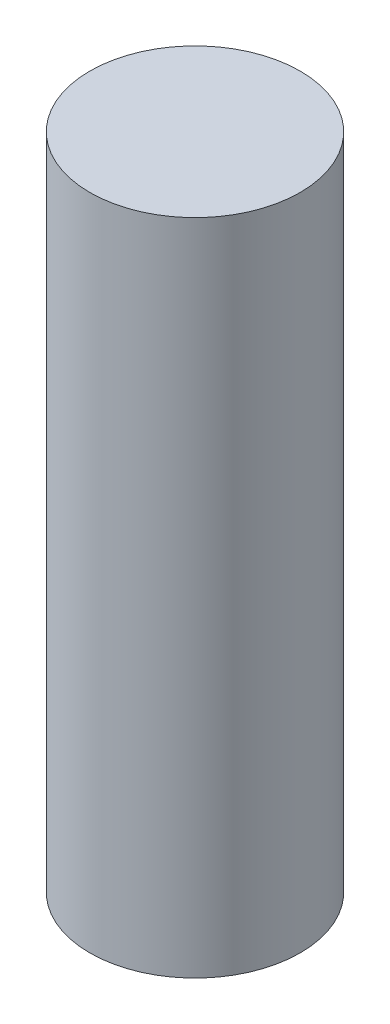
ISO-10303-21;
HEADER;
FILE_DESCRIPTION(('STEP AP214'),'2;1');
FILE_NAME('part.step','',(''),(''),'','','');
FILE_SCHEMA(('AUTOMOTIVE_DESIGN { 1 0 10303 214 1 1 1 1 }'));
ENDSEC;
DATA;
#1=APPLICATION_CONTEXT('core data for automotive mechanical design processes');
#2=APPLICATION_PROTOCOL_DEFINITION('international standard','automotive_design',2000,#1);
#3=PRODUCT_CONTEXT('',#1,'mechanical');
#4=PRODUCT('Part','Part','',(#3));
#5=PRODUCT_RELATED_PRODUCT_CATEGORY('part','',(#4));
#6=PRODUCT_DEFINITION_FORMATION('','',#4);
#7=PRODUCT_DEFINITION_CONTEXT('part definition',#1,'design');
#8=PRODUCT_DEFINITION('design','',#6,#7);
#9=PRODUCT_DEFINITION_SHAPE('','',#8);
#10=(LENGTH_UNIT() NAMED_UNIT(*) SI_UNIT(.MILLI.,.METRE.));
#11=(NAMED_UNIT(*) PLANE_ANGLE_UNIT() SI_UNIT($,.RADIAN.));
#12=(NAMED_UNIT(*) SI_UNIT($,.STERADIAN.) SOLID_ANGLE_UNIT());
#13=UNCERTAINTY_MEASURE_WITH_UNIT(LENGTH_MEASURE(1.E-05),#10,'distance_accuracy_value','');
#14=(GEOMETRIC_REPRESENTATION_CONTEXT(3) GLOBAL_UNCERTAINTY_ASSIGNED_CONTEXT((#13)) GLOBAL_UNIT_ASSIGNED_CONTEXT((#10,
#11,#12)) REPRESENTATION_CONTEXT('',''));
#15=CARTESIAN_POINT('',(0.,0.,0.));
#16=DIRECTION('',(0.,0.,1.));
#17=DIRECTION('',(1.,0.,0.));
#18=AXIS2_PLACEMENT_3D('',#15,#16,#17);
#19=CARTESIAN_POINT('',(0.,77.2159999999999,0.));
#20=DIRECTION('',(0.,-1.,0.));
#21=DIRECTION('',(0.,0.,-1.));
#22=AXIS2_PLACEMENT_3D('',#19,#20,#21);
#23=CYLINDRICAL_SURFACE('',#22,12.3317);
#24=CARTESIAN_POINT('',(0.,77.2159999999999,0.));
#25=DIRECTION('',(0.,1.,0.));
#26=DIRECTION('',(0.,0.,1.));
#27=AXIS2_PLACEMENT_3D('',#24,#25,#26);
#28=CIRCLE('',#27,12.3317);
#29=CARTESIAN_POINT('',(0.,77.2159999999999,12.3317));
#30=VERTEX_POINT('',#29);
#31=EDGE_CURVE('E12',#30,#30,#28,.T.);
#32=ORIENTED_EDGE('',*,*,#31,.F.);
#33=EDGE_LOOP('',(#32));
#34=FACE_BOUND('',#33,.T.);
#35=CARTESIAN_POINT('',(0.,0.,0.));
#36=DIRECTION('',(0.,1.,0.));
#37=DIRECTION('',(0.,0.,1.));
#38=AXIS2_PLACEMENT_3D('',#35,#36,#37);
#39=CIRCLE('',#38,12.3317);
#40=CARTESIAN_POINT('',(0.,0.,12.3317));
#41=VERTEX_POINT('',#40);
#42=EDGE_CURVE('E46',#41,#41,#39,.T.);
#43=ORIENTED_EDGE('',*,*,#42,.T.);
#44=EDGE_LOOP('',(#43));
#45=FACE_BOUND('',#44,.T.);
#46=ADVANCED_FACE('F43',(#34,#45),#23,.T.);
#47=CARTESIAN_POINT('',(0.,77.2159999999999,0.));
#48=DIRECTION('',(0.,1.,0.));
#49=DIRECTION('',(0.,0.,1.));
#50=AXIS2_PLACEMENT_3D('',#47,#48,#49);
#51=PLANE('',#50);
#52=ORIENTED_EDGE('',*,*,#31,.T.);
#53=EDGE_LOOP('',(#52));
#54=FACE_BOUND('',#53,.T.);
#55=ADVANCED_FACE('F58',(#54),#51,.T.);
#56=CARTESIAN_POINT('',(0.,0.,0.));
#57=DIRECTION('',(0.,1.,0.));
#58=DIRECTION('',(0.,0.,1.));
#59=AXIS2_PLACEMENT_3D('',#56,#57,#58);
#60=PLANE('',#59);
#61=ORIENTED_EDGE('',*,*,#42,.F.);
#62=EDGE_LOOP('',(#61));
#63=FACE_BOUND('',#62,.T.);
#64=ADVANCED_FACE('F56',(#63),#60,.F.);
#65=CLOSED_SHELL('',(#46,#55,#64));
#66=MANIFOLD_SOLID_BREP('B2',#65);
#67=ADVANCED_BREP_SHAPE_REPRESENTATION('',(#18,#66),#14);
#68=SHAPE_DEFINITION_REPRESENTATION(#9,#67);
ENDSEC;
END-ISO-10303-21;
